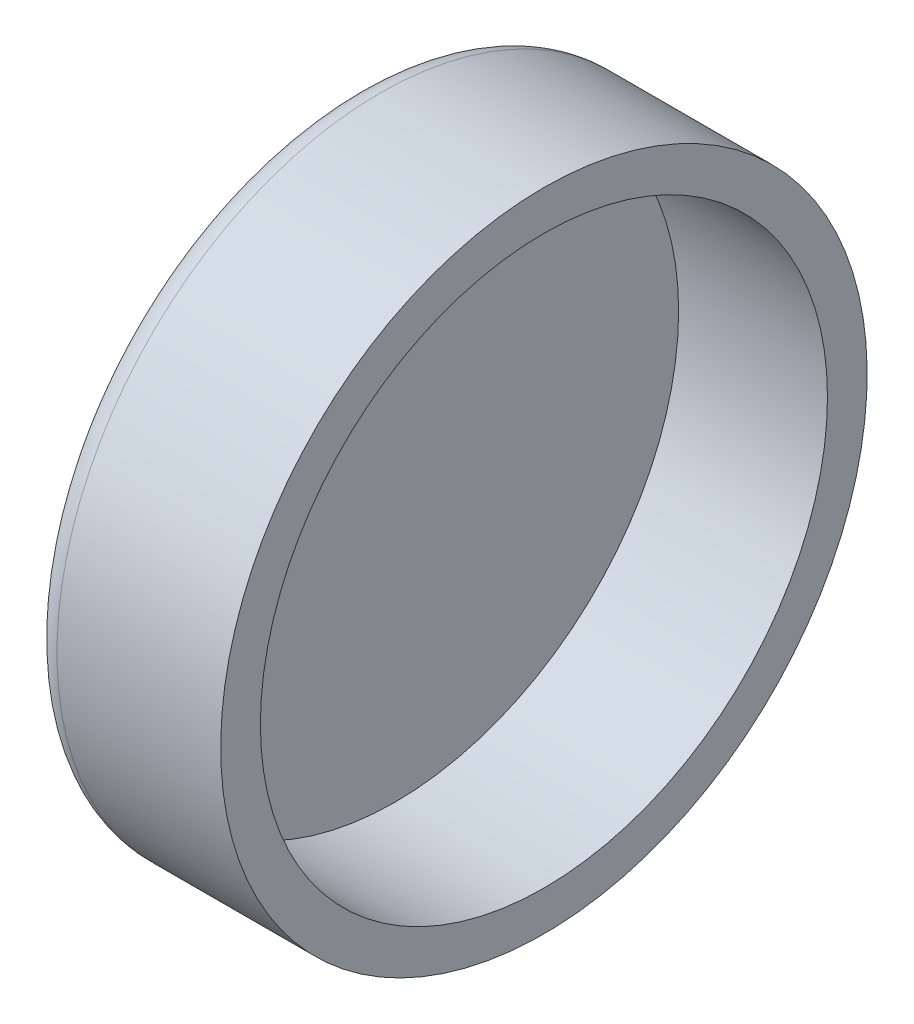
ISO-10303-21;
HEADER;
FILE_DESCRIPTION(('STEP AP214'),'2;1');
FILE_NAME('part.step','',(''),(''),'','','');
FILE_SCHEMA(('AUTOMOTIVE_DESIGN { 1 0 10303 214 1 1 1 1 }'));
ENDSEC;
DATA;
#1=APPLICATION_CONTEXT('core data for automotive mechanical design processes');
#2=APPLICATION_PROTOCOL_DEFINITION('international standard','automotive_design',2000,#1);
#3=PRODUCT_CONTEXT('',#1,'mechanical');
#4=PRODUCT('Part','Part','',(#3));
#5=PRODUCT_RELATED_PRODUCT_CATEGORY('part','',(#4));
#6=PRODUCT_DEFINITION_FORMATION('','',#4);
#7=PRODUCT_DEFINITION_CONTEXT('part definition',#1,'design');
#8=PRODUCT_DEFINITION('design','',#6,#7);
#9=PRODUCT_DEFINITION_SHAPE('','',#8);
#10=(LENGTH_UNIT() NAMED_UNIT(*) SI_UNIT(.MILLI.,.METRE.));
#11=(NAMED_UNIT(*) PLANE_ANGLE_UNIT() SI_UNIT($,.RADIAN.));
#12=(NAMED_UNIT(*) SI_UNIT($,.STERADIAN.) SOLID_ANGLE_UNIT());
#13=UNCERTAINTY_MEASURE_WITH_UNIT(LENGTH_MEASURE(1.E-05),#10,'distance_accuracy_value','');
#14=(GEOMETRIC_REPRESENTATION_CONTEXT(3) GLOBAL_UNCERTAINTY_ASSIGNED_CONTEXT((#13)) GLOBAL_UNIT_ASSIGNED_CONTEXT((#10,
#11,#12)) REPRESENTATION_CONTEXT('',''));
#15=CARTESIAN_POINT('',(0.,0.,0.));
#16=DIRECTION('',(0.,0.,1.));
#17=DIRECTION('',(1.,0.,0.));
#18=AXIS2_PLACEMENT_3D('',#15,#16,#17);
#19=CARTESIAN_POINT('',(0.,57.15,0.));
#20=DIRECTION('',(1.,0.,0.));
#21=DIRECTION('',(0.,1.,0.));
#22=AXIS2_PLACEMENT_3D('',#19,#20,#21);
#23=PLANE('',#22);
#24=CARTESIAN_POINT('',(0.,0.,0.));
#25=DIRECTION('',(1.,0.,0.));
#26=DIRECTION('',(0.,1.,0.));
#27=AXIS2_PLACEMENT_3D('',#24,#25,#26);
#28=CIRCLE('',#27,65.15);
#29=CARTESIAN_POINT('',(0.,65.15,0.));
#30=VERTEX_POINT('',#29);
#31=EDGE_CURVE('E42',#30,#30,#28,.T.);
#32=ORIENTED_EDGE('',*,*,#31,.T.);
#33=EDGE_LOOP('',(#32));
#34=FACE_BOUND('',#33,.T.);
#35=CARTESIAN_POINT('',(0.,0.,0.));
#36=DIRECTION('',(1.,0.,0.));
#37=DIRECTION('',(0.,1.,0.));
#38=AXIS2_PLACEMENT_3D('',#35,#36,#37);
#39=CIRCLE('',#38,57.15);
#40=CARTESIAN_POINT('',(0.,57.15,0.));
#41=VERTEX_POINT('',#40);
#42=EDGE_CURVE('E51',#41,#41,#39,.T.);
#43=ORIENTED_EDGE('',*,*,#42,.F.);
#44=EDGE_LOOP('',(#43));
#45=FACE_BOUND('',#44,.T.);
#46=ADVANCED_FACE('F31',(#34,#45),#23,.T.);
#47=CARTESIAN_POINT('',(-30.,0.,0.));
#48=DIRECTION('',(1.,0.,0.));
#49=DIRECTION('',(0.,1.,0.));
#50=AXIS2_PLACEMENT_3D('',#47,#48,#49);
#51=CYLINDRICAL_SURFACE('',#50,65.15);
#52=CARTESIAN_POINT('',(-33.,0.,0.));
#53=DIRECTION('',(-1.,0.,0.));
#54=DIRECTION('',(0.,-1.,0.));
#55=AXIS2_PLACEMENT_3D('',#52,#53,#54);
#56=CIRCLE('',#55,65.15);
#57=CARTESIAN_POINT('',(-33.,-65.15,0.));
#58=VERTEX_POINT('',#57);
#59=EDGE_CURVE('E38',#58,#58,#56,.F.);
#60=ORIENTED_EDGE('',*,*,#59,.T.);
#61=EDGE_LOOP('',(#60));
#62=FACE_BOUND('',#61,.T.);
#63=ORIENTED_EDGE('',*,*,#31,.F.);
#64=EDGE_LOOP('',(#63));
#65=FACE_BOUND('',#64,.T.);
#66=ADVANCED_FACE('F59',(#62,#65),#51,.T.);
#67=CARTESIAN_POINT('',(-38.,65.15,0.));
#68=DIRECTION('',(-1.,0.,0.));
#69=DIRECTION('',(0.,-1.,0.));
#70=AXIS2_PLACEMENT_3D('',#67,#68,#69);
#71=PLANE('',#70);
#72=CARTESIAN_POINT('',(-38.,0.,0.));
#73=DIRECTION('',(-1.,0.,0.));
#74=DIRECTION('',(0.,-1.,0.));
#75=AXIS2_PLACEMENT_3D('',#72,#73,#74);
#76=CIRCLE('',#75,60.15);
#77=CARTESIAN_POINT('',(-38.,-60.15,0.));
#78=VERTEX_POINT('',#77);
#79=EDGE_CURVE('E10',#78,#78,#76,.T.);
#80=ORIENTED_EDGE('',*,*,#79,.T.);
#81=EDGE_LOOP('',(#80));
#82=FACE_BOUND('',#81,.T.);
#83=ADVANCED_FACE('F64',(#82),#71,.T.);
#84=CARTESIAN_POINT('',(-30.,57.15,0.));
#85=DIRECTION('',(1.,0.,0.));
#86=DIRECTION('',(0.,1.,0.));
#87=AXIS2_PLACEMENT_3D('',#84,#85,#86);
#88=PLANE('',#87);
#89=CARTESIAN_POINT('',(-30.,0.,0.));
#90=DIRECTION('',(1.,0.,0.));
#91=DIRECTION('',(0.,1.,0.));
#92=AXIS2_PLACEMENT_3D('',#89,#90,#91);
#93=CIRCLE('',#92,57.15);
#94=CARTESIAN_POINT('',(-30.,57.15,0.));
#95=VERTEX_POINT('',#94);
#96=EDGE_CURVE('E46',#95,#95,#93,.T.);
#97=ORIENTED_EDGE('',*,*,#96,.T.);
#98=EDGE_LOOP('',(#97));
#99=FACE_BOUND('',#98,.T.);
#100=ADVANCED_FACE('F69',(#99),#88,.T.);
#101=CARTESIAN_POINT('',(-30.,0.,0.));
#102=DIRECTION('',(1.,0.,0.));
#103=DIRECTION('',(0.,1.,0.));
#104=AXIS2_PLACEMENT_3D('',#101,#102,#103);
#105=CYLINDRICAL_SURFACE('',#104,57.15);
#106=ORIENTED_EDGE('',*,*,#42,.T.);
#107=EDGE_LOOP('',(#106));
#108=FACE_BOUND('',#107,.T.);
#109=ORIENTED_EDGE('',*,*,#96,.F.);
#110=EDGE_LOOP('',(#109));
#111=FACE_BOUND('',#110,.T.);
#112=ADVANCED_FACE('F55',(#108,#111),#105,.F.);
#113=CARTESIAN_POINT('',(-33.,0.,0.));
#114=DIRECTION('',(-1.,0.,0.));
#115=DIRECTION('',(0.,-1.,0.));
#116=AXIS2_PLACEMENT_3D('',#113,#114,#115);
#117=TOROIDAL_SURFACE('',#116,60.15,5.);
#118=ORIENTED_EDGE('',*,*,#79,.F.);
#119=EDGE_LOOP('',(#118));
#120=FACE_BOUND('',#119,.T.);
#121=ORIENTED_EDGE('',*,*,#59,.F.);
#122=EDGE_LOOP('',(#121));
#123=FACE_BOUND('',#122,.T.);
#124=ADVANCED_FACE('F33',(#120,#123),#117,.T.);
#125=CLOSED_SHELL('',(#46,#66,#83,#100,#112,#124));
#126=MANIFOLD_SOLID_BREP('B2',#125);
#127=ADVANCED_BREP_SHAPE_REPRESENTATION('',(#18,#126),#14);
#128=SHAPE_DEFINITION_REPRESENTATION(#9,#127);
ENDSEC;
END-ISO-10303-21;
